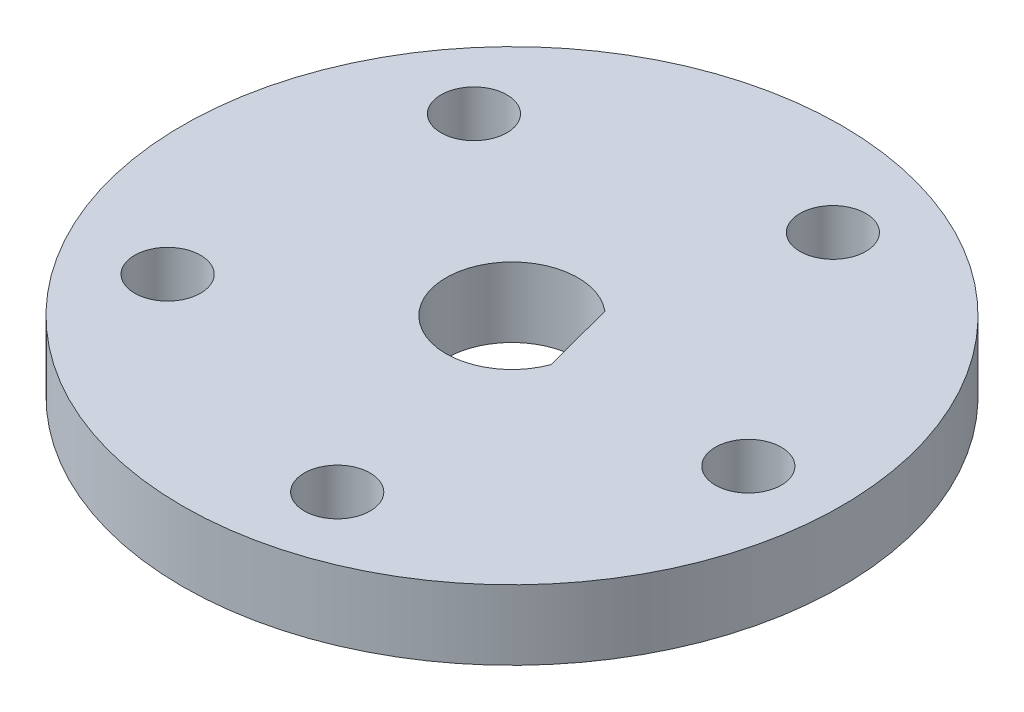
ISO-10303-21;
HEADER;
FILE_DESCRIPTION(('STEP AP214'),'2;1');
FILE_NAME('part.step','',(''),(''),'','','');
FILE_SCHEMA(('AUTOMOTIVE_DESIGN { 1 0 10303 214 1 1 1 1 }'));
ENDSEC;
DATA;
#1=APPLICATION_CONTEXT('core data for automotive mechanical design processes');
#2=APPLICATION_PROTOCOL_DEFINITION('international standard','automotive_design',2000,#1);
#3=PRODUCT_CONTEXT('',#1,'mechanical');
#4=PRODUCT('Part','Part','',(#3));
#5=PRODUCT_RELATED_PRODUCT_CATEGORY('part','',(#4));
#6=PRODUCT_DEFINITION_FORMATION('','',#4);
#7=PRODUCT_DEFINITION_CONTEXT('part definition',#1,'design');
#8=PRODUCT_DEFINITION('design','',#6,#7);
#9=PRODUCT_DEFINITION_SHAPE('','',#8);
#10=(LENGTH_UNIT() NAMED_UNIT(*) SI_UNIT(.MILLI.,.METRE.));
#11=(NAMED_UNIT(*) PLANE_ANGLE_UNIT() SI_UNIT($,.RADIAN.));
#12=(NAMED_UNIT(*) SI_UNIT($,.STERADIAN.) SOLID_ANGLE_UNIT());
#13=UNCERTAINTY_MEASURE_WITH_UNIT(LENGTH_MEASURE(1.E-05),#10,'distance_accuracy_value','');
#14=(GEOMETRIC_REPRESENTATION_CONTEXT(3) GLOBAL_UNCERTAINTY_ASSIGNED_CONTEXT((#13)) GLOBAL_UNIT_ASSIGNED_CONTEXT((#10,
#11,#12)) REPRESENTATION_CONTEXT('',''));
#15=CARTESIAN_POINT('',(0.,0.,0.));
#16=DIRECTION('',(0.,0.,1.));
#17=DIRECTION('',(1.,0.,0.));
#18=AXIS2_PLACEMENT_3D('',#15,#16,#17);
#19=CARTESIAN_POINT('',(0.,3.175,0.));
#20=DIRECTION('',(0.,1.,0.));
#21=DIRECTION('',(0.,0.,1.));
#22=AXIS2_PLACEMENT_3D('',#19,#20,#21);
#23=PLANE('',#22);
#24=CARTESIAN_POINT('',(2.97032960941059,3.175,10.9263275549007));
#25=DIRECTION('',(0.,1.,0.));
#26=DIRECTION('',(0.,0.,1.));
#27=AXIS2_PLACEMENT_3D('',#24,#25,#26);
#28=CIRCLE('',#27,1.5);
#29=CARTESIAN_POINT('',(2.97032960941059,3.175,12.4263275549007));
#30=VERTEX_POINT('',#29);
#31=EDGE_CURVE('E85',#30,#30,#28,.T.);
#32=ORIENTED_EDGE('',*,*,#31,.F.);
#33=EDGE_LOOP('',(#32));
#34=FACE_BOUND('',#33,.T.);
#35=CARTESIAN_POINT('',(4.01928706557957,3.175,-10.585500616881));
#36=DIRECTION('',(0.,1.,0.));
#37=DIRECTION('',(0.,0.,1.));
#38=AXIS2_PLACEMENT_3D('',#35,#36,#37);
#39=CIRCLE('',#38,1.5);
#40=CARTESIAN_POINT('',(4.01928706557957,3.175,-9.08550061688101));
#41=VERTEX_POINT('',#40);
#42=EDGE_CURVE('E97',#41,#41,#39,.T.);
#43=ORIENTED_EDGE('',*,*,#42,.F.);
#44=EDGE_LOOP('',(#43));
#45=FACE_BOUND('',#44,.T.);
#46=CARTESIAN_POINT('',(0.,3.175,0.));
#47=DIRECTION('',(0.,1.,0.));
#48=DIRECTION('',(0.,0.,1.));
#49=AXIS2_PLACEMENT_3D('',#46,#47,#48);
#50=CIRCLE('',#49,15.);
#51=CARTESIAN_POINT('',(0.,3.175,15.));
#52=VERTEX_POINT('',#51);
#53=EDGE_CURVE('E11',#52,#52,#50,.T.);
#54=ORIENTED_EDGE('',*,*,#53,.T.);
#55=EDGE_LOOP('',(#54));
#56=FACE_BOUND('',#55,.T.);
#57=CARTESIAN_POINT('',(-8.82538133139549,3.175,-7.09366873916284));
#58=DIRECTION('',(0.,1.,0.));
#59=DIRECTION('',(0.,0.,1.));
#60=AXIS2_PLACEMENT_3D('',#57,#58,#59);
#61=CIRCLE('',#60,1.5);
#62=CARTESIAN_POINT('',(-8.82538133139549,3.175,-5.59366873916284));
#63=VERTEX_POINT('',#62);
#64=EDGE_CURVE('E103',#63,#63,#61,.T.);
#65=ORIENTED_EDGE('',*,*,#64,.F.);
#66=EDGE_LOOP('',(#65));
#67=FACE_BOUND('',#66,.T.);
#68=CARTESIAN_POINT('',(11.3094373484666,3.175,0.551469569997456));
#69=DIRECTION('',(0.,1.,0.));
#70=DIRECTION('',(0.,0.,1.));
#71=AXIS2_PLACEMENT_3D('',#68,#69,#70);
#72=CIRCLE('',#71,1.5);
#73=CARTESIAN_POINT('',(11.3094373484666,3.175,2.05146956999746));
#74=VERTEX_POINT('',#73);
#75=EDGE_CURVE('E91',#74,#74,#72,.T.);
#76=ORIENTED_EDGE('',*,*,#75,.F.);
#77=EDGE_LOOP('',(#76));
#78=FACE_BOUND('',#77,.T.);
#79=CARTESIAN_POINT('',(-9.47367269206054,3.175,6.20137223114581));
#80=DIRECTION('',(0.,1.,0.));
#81=DIRECTION('',(0.,0.,1.));
#82=AXIS2_PLACEMENT_3D('',#79,#80,#81);
#83=CIRCLE('',#82,1.5);
#84=CARTESIAN_POINT('',(-9.47367269206054,3.175,7.70137223114581));
#85=VERTEX_POINT('',#84);
#86=EDGE_CURVE('E79',#85,#85,#83,.T.);
#87=ORIENTED_EDGE('',*,*,#86,.F.);
#88=EDGE_LOOP('',(#87));
#89=FACE_BOUND('',#88,.T.);
#90=CARTESIAN_POINT('',(0.,3.175,0.));
#91=DIRECTION('',(0.,1.,0.));
#92=DIRECTION('',(0.,0.,1.));
#93=AXIS2_PLACEMENT_3D('',#90,#91,#92);
#94=CIRCLE('',#93,3.);
#95=CARTESIAN_POINT('',(1.9347300221449,3.175,-2.29277555408531));
#96=VERTEX_POINT('',#95);
#97=CARTESIAN_POINT('',(2.81865392301277,3.175,1.02722444591469));
#98=VERTEX_POINT('',#97);
#99=EDGE_CURVE('E69',#96,#98,#94,.T.);
#100=ORIENTED_EDGE('',*,*,#99,.F.);
#101=DIRECTION('',(0.257279628998692,0.,0.966336997378397));
#102=VECTOR('',#101,1.);
#103=CARTESIAN_POINT('',(2.37669197257883,3.175,-0.632775554085311));
#104=LINE('',#103,#102);
#105=EDGE_CURVE('E49',#96,#98,#104,.T.);
#106=ORIENTED_EDGE('',*,*,#105,.T.);
#107=EDGE_LOOP('',(#100,#106));
#108=FACE_BOUND('',#107,.T.);
#109=ADVANCED_FACE('F34',(#34,#45,#56,#67,#78,#89,#108),#23,.T.);
#110=CARTESIAN_POINT('',(0.,0.,0.));
#111=DIRECTION('',(0.,1.,0.));
#112=DIRECTION('',(0.,0.,1.));
#113=AXIS2_PLACEMENT_3D('',#110,#111,#112);
#114=PLANE('',#113);
#115=CARTESIAN_POINT('',(-9.47367269206054,0.,6.20137223114581));
#116=DIRECTION('',(0.,1.,0.));
#117=DIRECTION('',(0.,0.,1.));
#118=AXIS2_PLACEMENT_3D('',#115,#116,#117);
#119=CIRCLE('',#118,1.5);
#120=CARTESIAN_POINT('',(-9.47367269206054,0.,7.70137223114581));
#121=VERTEX_POINT('',#120);
#122=EDGE_CURVE('E65',#121,#121,#119,.T.);
#123=ORIENTED_EDGE('',*,*,#122,.T.);
#124=EDGE_LOOP('',(#123));
#125=FACE_BOUND('',#124,.T.);
#126=CARTESIAN_POINT('',(2.97032960941059,0.,10.9263275549007));
#127=DIRECTION('',(0.,1.,0.));
#128=DIRECTION('',(0.,0.,1.));
#129=AXIS2_PLACEMENT_3D('',#126,#127,#128);
#130=CIRCLE('',#129,1.5);
#131=CARTESIAN_POINT('',(2.97032960941059,0.,12.4263275549007));
#132=VERTEX_POINT('',#131);
#133=EDGE_CURVE('E82',#132,#132,#130,.T.);
#134=ORIENTED_EDGE('',*,*,#133,.T.);
#135=EDGE_LOOP('',(#134));
#136=FACE_BOUND('',#135,.T.);
#137=CARTESIAN_POINT('',(11.3094373484666,0.,0.551469569997456));
#138=DIRECTION('',(0.,1.,0.));
#139=DIRECTION('',(0.,0.,1.));
#140=AXIS2_PLACEMENT_3D('',#137,#138,#139);
#141=CIRCLE('',#140,1.5);
#142=CARTESIAN_POINT('',(11.3094373484666,0.,2.05146956999746));
#143=VERTEX_POINT('',#142);
#144=EDGE_CURVE('E88',#143,#143,#141,.T.);
#145=ORIENTED_EDGE('',*,*,#144,.T.);
#146=EDGE_LOOP('',(#145));
#147=FACE_BOUND('',#146,.T.);
#148=CARTESIAN_POINT('',(4.01928706557957,0.,-10.585500616881));
#149=DIRECTION('',(0.,1.,0.));
#150=DIRECTION('',(0.,0.,1.));
#151=AXIS2_PLACEMENT_3D('',#148,#149,#150);
#152=CIRCLE('',#151,1.5);
#153=CARTESIAN_POINT('',(4.01928706557957,0.,-9.08550061688101));
#154=VERTEX_POINT('',#153);
#155=EDGE_CURVE('E94',#154,#154,#152,.T.);
#156=ORIENTED_EDGE('',*,*,#155,.T.);
#157=EDGE_LOOP('',(#156));
#158=FACE_BOUND('',#157,.T.);
#159=CARTESIAN_POINT('',(-8.82538133139549,0.,-7.09366873916284));
#160=DIRECTION('',(0.,1.,0.));
#161=DIRECTION('',(0.,0.,1.));
#162=AXIS2_PLACEMENT_3D('',#159,#160,#161);
#163=CIRCLE('',#162,1.5);
#164=CARTESIAN_POINT('',(-8.82538133139549,0.,-5.59366873916284));
#165=VERTEX_POINT('',#164);
#166=EDGE_CURVE('E100',#165,#165,#163,.T.);
#167=ORIENTED_EDGE('',*,*,#166,.T.);
#168=EDGE_LOOP('',(#167));
#169=FACE_BOUND('',#168,.T.);
#170=CARTESIAN_POINT('',(0.,0.,0.));
#171=DIRECTION('',(0.,1.,0.));
#172=DIRECTION('',(0.,0.,1.));
#173=AXIS2_PLACEMENT_3D('',#170,#171,#172);
#174=CIRCLE('',#173,15.);
#175=CARTESIAN_POINT('',(0.,0.,15.));
#176=VERTEX_POINT('',#175);
#177=EDGE_CURVE('E38',#176,#176,#174,.T.);
#178=ORIENTED_EDGE('',*,*,#177,.F.);
#179=EDGE_LOOP('',(#178));
#180=FACE_BOUND('',#179,.T.);
#181=DIRECTION('',(0.257279628998692,0.,0.966336997378397));
#182=VECTOR('',#181,1.);
#183=CARTESIAN_POINT('',(2.37669197257883,0.,-0.632775554085311));
#184=LINE('',#183,#182);
#185=CARTESIAN_POINT('',(1.9347300221449,0.,-2.29277555408531));
#186=VERTEX_POINT('',#185);
#187=CARTESIAN_POINT('',(2.81865392301277,0.,1.02722444591469));
#188=VERTEX_POINT('',#187);
#189=EDGE_CURVE('E63',#186,#188,#184,.T.);
#190=ORIENTED_EDGE('',*,*,#189,.F.);
#191=CARTESIAN_POINT('',(0.,0.,0.));
#192=DIRECTION('',(0.,1.,0.));
#193=DIRECTION('',(0.,0.,1.));
#194=AXIS2_PLACEMENT_3D('',#191,#192,#193);
#195=CIRCLE('',#194,3.);
#196=EDGE_CURVE('E75',#186,#188,#195,.T.);
#197=ORIENTED_EDGE('',*,*,#196,.T.);
#198=EDGE_LOOP('',(#190,#197));
#199=FACE_BOUND('',#198,.T.);
#200=ADVANCED_FACE('F109',(#125,#136,#147,#158,#169,#180,#199),#114,.F.);
#201=CARTESIAN_POINT('',(0.,3.175,0.));
#202=DIRECTION('',(0.,-1.,0.));
#203=DIRECTION('',(0.,0.,-1.));
#204=AXIS2_PLACEMENT_3D('',#201,#202,#203);
#205=CYLINDRICAL_SURFACE('',#204,15.);
#206=ORIENTED_EDGE('',*,*,#53,.F.);
#207=EDGE_LOOP('',(#206));
#208=FACE_BOUND('',#207,.T.);
#209=ORIENTED_EDGE('',*,*,#177,.T.);
#210=EDGE_LOOP('',(#209));
#211=FACE_BOUND('',#210,.T.);
#212=ADVANCED_FACE('F36',(#208,#211),#205,.T.);
#213=CARTESIAN_POINT('',(-8.82538133139549,3.175,-7.09366873916284));
#214=DIRECTION('',(0.,-1.,0.));
#215=DIRECTION('',(0.,0.,-1.));
#216=AXIS2_PLACEMENT_3D('',#213,#214,#215);
#217=CYLINDRICAL_SURFACE('',#216,1.5);
#218=ORIENTED_EDGE('',*,*,#64,.T.);
#219=EDGE_LOOP('',(#218));
#220=FACE_BOUND('',#219,.T.);
#221=ORIENTED_EDGE('',*,*,#166,.F.);
#222=EDGE_LOOP('',(#221));
#223=FACE_BOUND('',#222,.T.);
#224=ADVANCED_FACE('F112',(#220,#223),#217,.F.);
#225=CARTESIAN_POINT('',(4.01928706557957,3.175,-10.585500616881));
#226=DIRECTION('',(0.,-1.,0.));
#227=DIRECTION('',(0.,0.,-1.));
#228=AXIS2_PLACEMENT_3D('',#225,#226,#227);
#229=CYLINDRICAL_SURFACE('',#228,1.5);
#230=ORIENTED_EDGE('',*,*,#42,.T.);
#231=EDGE_LOOP('',(#230));
#232=FACE_BOUND('',#231,.T.);
#233=ORIENTED_EDGE('',*,*,#155,.F.);
#234=EDGE_LOOP('',(#233));
#235=FACE_BOUND('',#234,.T.);
#236=ADVANCED_FACE('F114',(#232,#235),#229,.F.);
#237=CARTESIAN_POINT('',(11.3094373484666,3.175,0.551469569997456));
#238=DIRECTION('',(0.,-1.,0.));
#239=DIRECTION('',(0.,0.,-1.));
#240=AXIS2_PLACEMENT_3D('',#237,#238,#239);
#241=CYLINDRICAL_SURFACE('',#240,1.5);
#242=ORIENTED_EDGE('',*,*,#75,.T.);
#243=EDGE_LOOP('',(#242));
#244=FACE_BOUND('',#243,.T.);
#245=ORIENTED_EDGE('',*,*,#144,.F.);
#246=EDGE_LOOP('',(#245));
#247=FACE_BOUND('',#246,.T.);
#248=ADVANCED_FACE('F121',(#244,#247),#241,.F.);
#249=CARTESIAN_POINT('',(2.97032960941059,3.175,10.9263275549007));
#250=DIRECTION('',(0.,-1.,0.));
#251=DIRECTION('',(0.,0.,-1.));
#252=AXIS2_PLACEMENT_3D('',#249,#250,#251);
#253=CYLINDRICAL_SURFACE('',#252,1.5);
#254=ORIENTED_EDGE('',*,*,#31,.T.);
#255=EDGE_LOOP('',(#254));
#256=FACE_BOUND('',#255,.T.);
#257=ORIENTED_EDGE('',*,*,#133,.F.);
#258=EDGE_LOOP('',(#257));
#259=FACE_BOUND('',#258,.T.);
#260=ADVANCED_FACE('F147',(#256,#259),#253,.F.);
#261=CARTESIAN_POINT('',(-9.47367269206054,3.175,6.20137223114581));
#262=DIRECTION('',(0.,-1.,0.));
#263=DIRECTION('',(0.,0.,-1.));
#264=AXIS2_PLACEMENT_3D('',#261,#262,#263);
#265=CYLINDRICAL_SURFACE('',#264,1.5);
#266=ORIENTED_EDGE('',*,*,#86,.T.);
#267=EDGE_LOOP('',(#266));
#268=FACE_BOUND('',#267,.T.);
#269=ORIENTED_EDGE('',*,*,#122,.F.);
#270=EDGE_LOOP('',(#269));
#271=FACE_BOUND('',#270,.T.);
#272=ADVANCED_FACE('F144',(#268,#271),#265,.F.);
#273=CARTESIAN_POINT('',(2.37669197257883,0.,-0.632775554085311));
#274=DIRECTION('',(-0.966336997378397,0.,0.257279628998692));
#275=DIRECTION('',(0.257279628998692,0.,0.966336997378397));
#276=AXIS2_PLACEMENT_3D('',#273,#274,#275);
#277=PLANE('',#276);
#278=ORIENTED_EDGE('',*,*,#105,.F.);
#279=DIRECTION('',(0.,1.,0.));
#280=VECTOR('',#279,1.);
#281=CARTESIAN_POINT('',(1.9347300221449,0.,-2.29277555408531));
#282=LINE('',#281,#280);
#283=EDGE_CURVE('E66',#186,#96,#282,.T.);
#284=ORIENTED_EDGE('',*,*,#283,.F.);
#285=ORIENTED_EDGE('',*,*,#189,.T.);
#286=DIRECTION('',(0.,1.,0.));
#287=VECTOR('',#286,1.);
#288=CARTESIAN_POINT('',(2.81865392301277,0.,1.02722444591469));
#289=LINE('',#288,#287);
#290=EDGE_CURVE('E56',#188,#98,#289,.T.);
#291=ORIENTED_EDGE('',*,*,#290,.T.);
#292=EDGE_LOOP('',(#278,#284,#285,#291));
#293=FACE_BOUND('',#292,.T.);
#294=ADVANCED_FACE('F61',(#293),#277,.T.);
#295=CARTESIAN_POINT('',(0.,0.,0.));
#296=DIRECTION('',(0.,1.,0.));
#297=DIRECTION('',(0.,0.,1.));
#298=AXIS2_PLACEMENT_3D('',#295,#296,#297);
#299=CYLINDRICAL_SURFACE('',#298,3.);
#300=ORIENTED_EDGE('',*,*,#99,.T.);
#301=ORIENTED_EDGE('',*,*,#290,.F.);
#302=ORIENTED_EDGE('',*,*,#196,.F.);
#303=ORIENTED_EDGE('',*,*,#283,.T.);
#304=EDGE_LOOP('',(#300,#301,#302,#303));
#305=FACE_BOUND('',#304,.T.);
#306=ADVANCED_FACE('F70',(#305),#299,.F.);
#307=CLOSED_SHELL('',(#109,#200,#212,#224,#236,#248,#260,#272,#294,#306));
#308=MANIFOLD_SOLID_BREP('B2',#307);
#309=ADVANCED_BREP_SHAPE_REPRESENTATION('',(#18,#308),#14);
#310=SHAPE_DEFINITION_REPRESENTATION(#9,#309);
ENDSEC;
END-ISO-10303-21;
